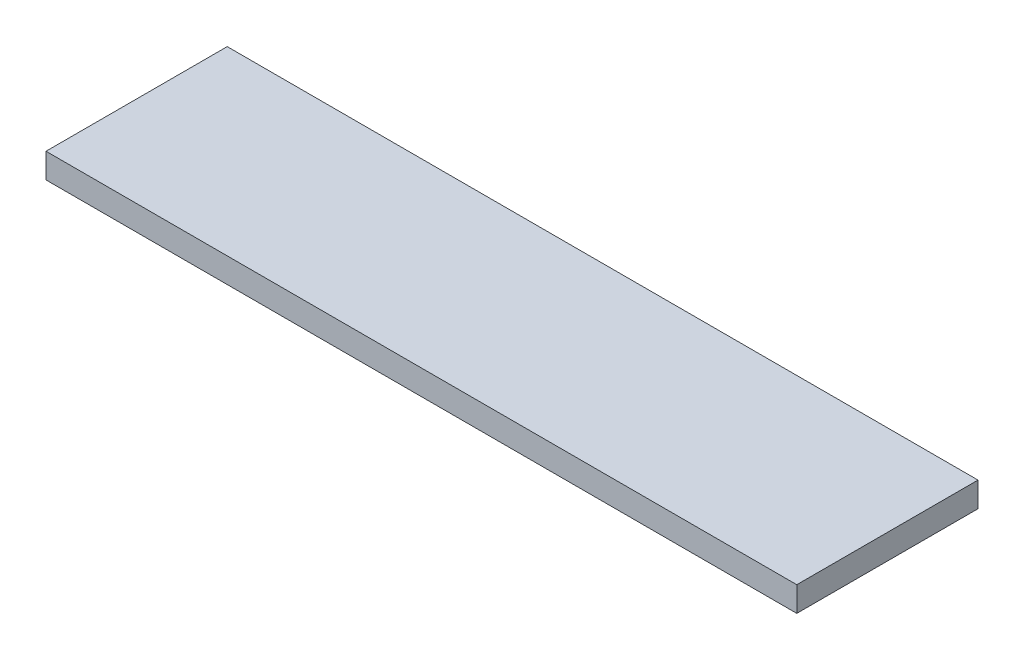
ISO-10303-21;
HEADER;
FILE_DESCRIPTION(('STEP AP214'),'2;1');
FILE_NAME('part.step','',(''),(''),'','','');
FILE_SCHEMA(('AUTOMOTIVE_DESIGN { 1 0 10303 214 1 1 1 1 }'));
ENDSEC;
DATA;
#1=APPLICATION_CONTEXT('core data for automotive mechanical design processes');
#2=APPLICATION_PROTOCOL_DEFINITION('international standard','automotive_design',2000,#1);
#3=PRODUCT_CONTEXT('',#1,'mechanical');
#4=PRODUCT('Part','Part','',(#3));
#5=PRODUCT_RELATED_PRODUCT_CATEGORY('part','',(#4));
#6=PRODUCT_DEFINITION_FORMATION('','',#4);
#7=PRODUCT_DEFINITION_CONTEXT('part definition',#1,'design');
#8=PRODUCT_DEFINITION('design','',#6,#7);
#9=PRODUCT_DEFINITION_SHAPE('','',#8);
#10=(LENGTH_UNIT() NAMED_UNIT(*) SI_UNIT(.MILLI.,.METRE.));
#11=(NAMED_UNIT(*) PLANE_ANGLE_UNIT() SI_UNIT($,.RADIAN.));
#12=(NAMED_UNIT(*) SI_UNIT($,.STERADIAN.) SOLID_ANGLE_UNIT());
#13=UNCERTAINTY_MEASURE_WITH_UNIT(LENGTH_MEASURE(1.E-05),#10,'distance_accuracy_value','');
#14=(GEOMETRIC_REPRESENTATION_CONTEXT(3) GLOBAL_UNCERTAINTY_ASSIGNED_CONTEXT((#13)) GLOBAL_UNIT_ASSIGNED_CONTEXT((#10,
#11,#12)) REPRESENTATION_CONTEXT('',''));
#15=CARTESIAN_POINT('',(0.,0.,0.));
#16=DIRECTION('',(0.,0.,1.));
#17=DIRECTION('',(1.,0.,0.));
#18=AXIS2_PLACEMENT_3D('',#15,#16,#17);
#19=CARTESIAN_POINT('',(145.,9.6,35.));
#20=DIRECTION('',(-1.,0.,0.));
#21=DIRECTION('',(0.,0.,1.));
#22=AXIS2_PLACEMENT_3D('',#19,#20,#21);
#23=PLANE('',#22);
#24=DIRECTION('',(0.,0.,-1.));
#25=VECTOR('',#24,1.);
#26=CARTESIAN_POINT('',(145.,0.,35.));
#27=LINE('',#26,#25);
#28=CARTESIAN_POINT('',(145.,0.,35.));
#29=VERTEX_POINT('',#28);
#30=CARTESIAN_POINT('',(145.,0.,-35.));
#31=VERTEX_POINT('',#30);
#32=EDGE_CURVE('E109',#29,#31,#27,.T.);
#33=ORIENTED_EDGE('',*,*,#32,.T.);
#34=DIRECTION('',(0.,-1.,0.));
#35=VECTOR('',#34,1.);
#36=CARTESIAN_POINT('',(145.,9.6,-35.));
#37=LINE('',#36,#35);
#38=CARTESIAN_POINT('',(145.,9.6,-35.));
#39=VERTEX_POINT('',#38);
#40=EDGE_CURVE('E11',#39,#31,#37,.T.);
#41=ORIENTED_EDGE('',*,*,#40,.F.);
#42=DIRECTION('',(0.,0.,-1.));
#43=VECTOR('',#42,1.);
#44=CARTESIAN_POINT('',(145.,9.6,35.));
#45=LINE('',#44,#43);
#46=CARTESIAN_POINT('',(145.,9.6,35.));
#47=VERTEX_POINT('',#46);
#48=EDGE_CURVE('E93',#47,#39,#45,.T.);
#49=ORIENTED_EDGE('',*,*,#48,.F.);
#50=DIRECTION('',(0.,-1.,0.));
#51=VECTOR('',#50,1.);
#52=CARTESIAN_POINT('',(145.,9.6,35.));
#53=LINE('',#52,#51);
#54=EDGE_CURVE('E105',#47,#29,#53,.T.);
#55=ORIENTED_EDGE('',*,*,#54,.T.);
#56=EDGE_LOOP('',(#33,#41,#49,#55));
#57=FACE_BOUND('',#56,.T.);
#58=ADVANCED_FACE('F41',(#57),#23,.F.);
#59=CARTESIAN_POINT('',(-145.,9.6,-35.));
#60=DIRECTION('',(0.,0.,1.));
#61=DIRECTION('',(1.,0.,0.));
#62=AXIS2_PLACEMENT_3D('',#59,#60,#61);
#63=PLANE('',#62);
#64=DIRECTION('',(-1.,0.,0.));
#65=VECTOR('',#64,1.);
#66=CARTESIAN_POINT('',(-145.,0.,-35.));
#67=LINE('',#66,#65);
#68=CARTESIAN_POINT('',(-145.,0.,-35.));
#69=VERTEX_POINT('',#68);
#70=EDGE_CURVE('E98',#31,#69,#67,.T.);
#71=ORIENTED_EDGE('',*,*,#70,.T.);
#72=DIRECTION('',(0.,-1.,0.));
#73=VECTOR('',#72,1.);
#74=CARTESIAN_POINT('',(-145.,9.6,-35.));
#75=LINE('',#74,#73);
#76=CARTESIAN_POINT('',(-145.,9.6,-35.));
#77=VERTEX_POINT('',#76);
#78=EDGE_CURVE('E50',#77,#69,#75,.T.);
#79=ORIENTED_EDGE('',*,*,#78,.F.);
#80=DIRECTION('',(-1.,0.,0.));
#81=VECTOR('',#80,1.);
#82=CARTESIAN_POINT('',(-145.,9.6,-35.));
#83=LINE('',#82,#81);
#84=EDGE_CURVE('E88',#39,#77,#83,.T.);
#85=ORIENTED_EDGE('',*,*,#84,.F.);
#86=ORIENTED_EDGE('',*,*,#40,.T.);
#87=EDGE_LOOP('',(#71,#79,#85,#86));
#88=FACE_BOUND('',#87,.T.);
#89=ADVANCED_FACE('F97',(#88),#63,.F.);
#90=CARTESIAN_POINT('',(-145.,9.6,35.));
#91=DIRECTION('',(1.,0.,0.));
#92=DIRECTION('',(0.,0.,-1.));
#93=AXIS2_PLACEMENT_3D('',#90,#91,#92);
#94=PLANE('',#93);
#95=DIRECTION('',(0.,0.,1.));
#96=VECTOR('',#95,1.);
#97=CARTESIAN_POINT('',(-145.,0.,35.));
#98=LINE('',#97,#96);
#99=CARTESIAN_POINT('',(-145.,0.,35.));
#100=VERTEX_POINT('',#99);
#101=EDGE_CURVE('E75',#69,#100,#98,.T.);
#102=ORIENTED_EDGE('',*,*,#101,.T.);
#103=DIRECTION('',(0.,-1.,0.));
#104=VECTOR('',#103,1.);
#105=CARTESIAN_POINT('',(-145.,9.6,35.));
#106=LINE('',#105,#104);
#107=CARTESIAN_POINT('',(-145.,9.6,35.));
#108=VERTEX_POINT('',#107);
#109=EDGE_CURVE('E100',#108,#100,#106,.T.);
#110=ORIENTED_EDGE('',*,*,#109,.F.);
#111=DIRECTION('',(0.,0.,1.));
#112=VECTOR('',#111,1.);
#113=CARTESIAN_POINT('',(-145.,9.6,35.));
#114=LINE('',#113,#112);
#115=EDGE_CURVE('E91',#77,#108,#114,.T.);
#116=ORIENTED_EDGE('',*,*,#115,.F.);
#117=ORIENTED_EDGE('',*,*,#78,.T.);
#118=EDGE_LOOP('',(#102,#110,#116,#117));
#119=FACE_BOUND('',#118,.T.);
#120=ADVANCED_FACE('F101',(#119),#94,.F.);
#121=CARTESIAN_POINT('',(-145.,9.6,35.));
#122=DIRECTION('',(0.,0.,-1.));
#123=DIRECTION('',(-1.,0.,0.));
#124=AXIS2_PLACEMENT_3D('',#121,#122,#123);
#125=PLANE('',#124);
#126=DIRECTION('',(1.,0.,0.));
#127=VECTOR('',#126,1.);
#128=CARTESIAN_POINT('',(-145.,0.,35.));
#129=LINE('',#128,#127);
#130=EDGE_CURVE('E81',#100,#29,#129,.T.);
#131=ORIENTED_EDGE('',*,*,#130,.T.);
#132=ORIENTED_EDGE('',*,*,#54,.F.);
#133=DIRECTION('',(1.,0.,0.));
#134=VECTOR('',#133,1.);
#135=CARTESIAN_POINT('',(-145.,9.6,35.));
#136=LINE('',#135,#134);
#137=EDGE_CURVE('E58',#108,#47,#136,.T.);
#138=ORIENTED_EDGE('',*,*,#137,.F.);
#139=ORIENTED_EDGE('',*,*,#109,.T.);
#140=EDGE_LOOP('',(#131,#132,#138,#139));
#141=FACE_BOUND('',#140,.T.);
#142=ADVANCED_FACE('F122',(#141),#125,.F.);
#143=CARTESIAN_POINT('',(0.,9.6,0.));
#144=DIRECTION('',(0.,-1.,0.));
#145=DIRECTION('',(0.,0.,-1.));
#146=AXIS2_PLACEMENT_3D('',#143,#144,#145);
#147=PLANE('',#146);
#148=ORIENTED_EDGE('',*,*,#48,.T.);
#149=ORIENTED_EDGE('',*,*,#84,.T.);
#150=ORIENTED_EDGE('',*,*,#115,.T.);
#151=ORIENTED_EDGE('',*,*,#137,.T.);
#152=EDGE_LOOP('',(#148,#149,#150,#151));
#153=FACE_BOUND('',#152,.T.);
#154=ADVANCED_FACE('F89',(#153),#147,.F.);
#155=CARTESIAN_POINT('',(0.,0.,0.));
#156=DIRECTION('',(0.,-1.,0.));
#157=DIRECTION('',(0.,0.,-1.));
#158=AXIS2_PLACEMENT_3D('',#155,#156,#157);
#159=PLANE('',#158);
#160=ORIENTED_EDGE('',*,*,#32,.F.);
#161=ORIENTED_EDGE('',*,*,#130,.F.);
#162=ORIENTED_EDGE('',*,*,#101,.F.);
#163=ORIENTED_EDGE('',*,*,#70,.F.);
#164=EDGE_LOOP('',(#160,#161,#162,#163));
#165=FACE_BOUND('',#164,.T.);
#166=ADVANCED_FACE('F125',(#165),#159,.T.);
#167=CLOSED_SHELL('',(#58,#89,#120,#142,#154,#166));
#168=MANIFOLD_SOLID_BREP('B2',#167);
#169=ADVANCED_BREP_SHAPE_REPRESENTATION('',(#18,#168),#14);
#170=SHAPE_DEFINITION_REPRESENTATION(#9,#169);
ENDSEC;
END-ISO-10303-21;
